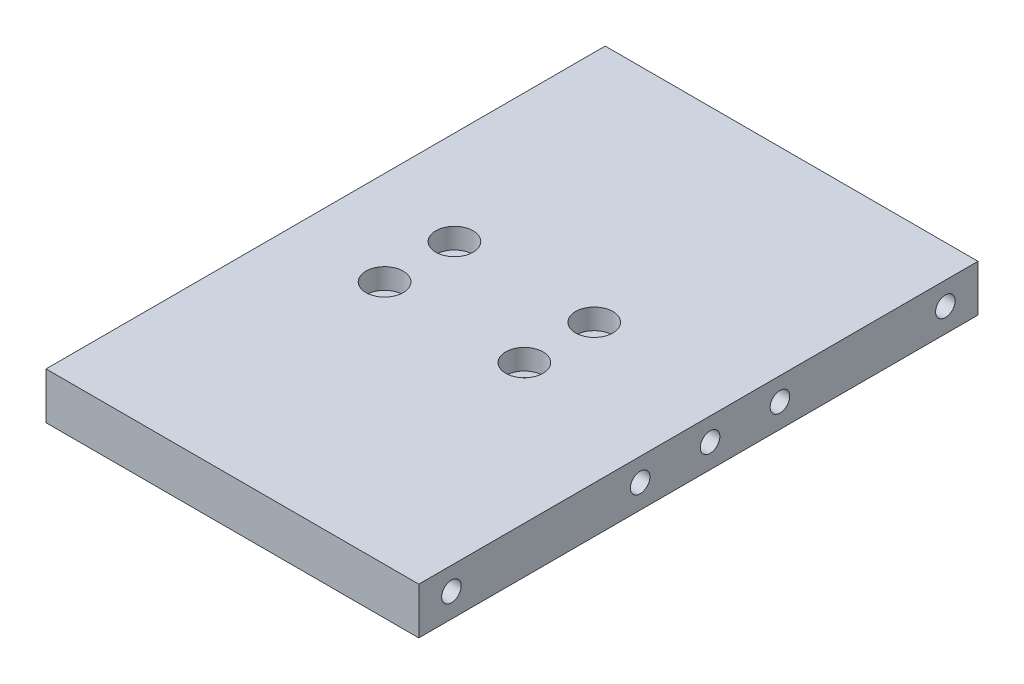
ISO-10303-21;
HEADER;
FILE_DESCRIPTION(('STEP AP214'),'2;1');
FILE_NAME('part.step','',(''),(''),'','','');
FILE_SCHEMA(('AUTOMOTIVE_DESIGN { 1 0 10303 214 1 1 1 1 }'));
ENDSEC;
DATA;
#1=APPLICATION_CONTEXT('core data for automotive mechanical design processes');
#2=APPLICATION_PROTOCOL_DEFINITION('international standard','automotive_design',2000,#1);
#3=PRODUCT_CONTEXT('',#1,'mechanical');
#4=PRODUCT('Part','Part','',(#3));
#5=PRODUCT_RELATED_PRODUCT_CATEGORY('part','',(#4));
#6=PRODUCT_DEFINITION_FORMATION('','',#4);
#7=PRODUCT_DEFINITION_CONTEXT('part definition',#1,'design');
#8=PRODUCT_DEFINITION('design','',#6,#7);
#9=PRODUCT_DEFINITION_SHAPE('','',#8);
#10=(LENGTH_UNIT() NAMED_UNIT(*) SI_UNIT(.MILLI.,.METRE.));
#11=(NAMED_UNIT(*) PLANE_ANGLE_UNIT() SI_UNIT($,.RADIAN.));
#12=(NAMED_UNIT(*) SI_UNIT($,.STERADIAN.) SOLID_ANGLE_UNIT());
#13=UNCERTAINTY_MEASURE_WITH_UNIT(LENGTH_MEASURE(1.E-05),#10,'distance_accuracy_value','');
#14=(GEOMETRIC_REPRESENTATION_CONTEXT(3) GLOBAL_UNCERTAINTY_ASSIGNED_CONTEXT((#13)) GLOBAL_UNIT_ASSIGNED_CONTEXT((#10,
#11,#12)) REPRESENTATION_CONTEXT('',''));
#15=CARTESIAN_POINT('',(0.,0.,0.));
#16=DIRECTION('',(0.,0.,1.));
#17=DIRECTION('',(1.,0.,0.));
#18=AXIS2_PLACEMENT_3D('',#15,#16,#17);
#19=CARTESIAN_POINT('',(-40.,5.,60.));
#20=DIRECTION('',(1.,0.,0.));
#21=DIRECTION('',(0.,0.,-1.));
#22=AXIS2_PLACEMENT_3D('',#19,#20,#21);
#23=PLANE('',#22);
#24=DIRECTION('',(0.,0.,1.));
#25=VECTOR('',#24,1.);
#26=CARTESIAN_POINT('',(-40.,-5.,60.));
#27=LINE('',#26,#25);
#28=CARTESIAN_POINT('',(-40.,-5.,-60.));
#29=VERTEX_POINT('',#28);
#30=CARTESIAN_POINT('',(-40.,-5.,60.));
#31=VERTEX_POINT('',#30);
#32=EDGE_CURVE('E204',#29,#31,#27,.T.);
#33=ORIENTED_EDGE('',*,*,#32,.T.);
#34=DIRECTION('',(0.,-1.,0.));
#35=VECTOR('',#34,1.);
#36=CARTESIAN_POINT('',(-40.,5.,60.));
#37=LINE('',#36,#35);
#38=CARTESIAN_POINT('',(-40.,5.,60.));
#39=VERTEX_POINT('',#38);
#40=EDGE_CURVE('E11',#39,#31,#37,.T.);
#41=ORIENTED_EDGE('',*,*,#40,.F.);
#42=DIRECTION('',(0.,0.,1.));
#43=VECTOR('',#42,1.);
#44=CARTESIAN_POINT('',(-40.,5.,60.));
#45=LINE('',#44,#43);
#46=CARTESIAN_POINT('',(-40.,5.,-60.));
#47=VERTEX_POINT('',#46);
#48=EDGE_CURVE('E205',#47,#39,#45,.T.);
#49=ORIENTED_EDGE('',*,*,#48,.F.);
#50=DIRECTION('',(0.,-1.,0.));
#51=VECTOR('',#50,1.);
#52=CARTESIAN_POINT('',(-40.,5.,-60.));
#53=LINE('',#52,#51);
#54=EDGE_CURVE('E211',#47,#29,#53,.T.);
#55=ORIENTED_EDGE('',*,*,#54,.T.);
#56=EDGE_LOOP('',(#33,#41,#49,#55));
#57=FACE_BOUND('',#56,.T.);
#58=ADVANCED_FACE('F42',(#57),#23,.F.);
#59=CARTESIAN_POINT('',(40.,5.,60.));
#60=DIRECTION('',(0.,0.,-1.));
#61=DIRECTION('',(-1.,0.,0.));
#62=AXIS2_PLACEMENT_3D('',#59,#60,#61);
#63=PLANE('',#62);
#64=DIRECTION('',(1.,0.,0.));
#65=VECTOR('',#64,1.);
#66=CARTESIAN_POINT('',(40.,-5.,60.));
#67=LINE('',#66,#65);
#68=CARTESIAN_POINT('',(40.,-5.,60.));
#69=VERTEX_POINT('',#68);
#70=EDGE_CURVE('E214',#31,#69,#67,.T.);
#71=ORIENTED_EDGE('',*,*,#70,.T.);
#72=DIRECTION('',(0.,-1.,0.));
#73=VECTOR('',#72,1.);
#74=CARTESIAN_POINT('',(40.,5.,60.));
#75=LINE('',#74,#73);
#76=CARTESIAN_POINT('',(40.,5.,60.));
#77=VERTEX_POINT('',#76);
#78=EDGE_CURVE('E50',#77,#69,#75,.T.);
#79=ORIENTED_EDGE('',*,*,#78,.F.);
#80=DIRECTION('',(1.,0.,0.));
#81=VECTOR('',#80,1.);
#82=CARTESIAN_POINT('',(40.,5.,60.));
#83=LINE('',#82,#81);
#84=EDGE_CURVE('E95',#39,#77,#83,.T.);
#85=ORIENTED_EDGE('',*,*,#84,.F.);
#86=ORIENTED_EDGE('',*,*,#40,.T.);
#87=EDGE_LOOP('',(#71,#79,#85,#86));
#88=FACE_BOUND('',#87,.T.);
#89=ADVANCED_FACE('F277',(#88),#63,.F.);
#90=CARTESIAN_POINT('',(40.,5.,60.));
#91=DIRECTION('',(-1.,0.,0.));
#92=DIRECTION('',(0.,0.,1.));
#93=AXIS2_PLACEMENT_3D('',#90,#91,#92);
#94=PLANE('',#93);
#95=CARTESIAN_POINT('',(40.,0.150021457665073,-52.9999999999997));
#96=DIRECTION('',(1.,0.,0.));
#97=DIRECTION('',(0.,0.,-1.));
#98=AXIS2_PLACEMENT_3D('',#95,#96,#97);
#99=CIRCLE('',#98,2.1);
#100=CARTESIAN_POINT('',(40.,0.150021457665073,-55.0999999999997));
#101=VERTEX_POINT('',#100);
#102=EDGE_CURVE('E171',#101,#101,#99,.T.);
#103=ORIENTED_EDGE('',*,*,#102,.F.);
#104=EDGE_LOOP('',(#103));
#105=FACE_BOUND('',#104,.T.);
#106=CARTESIAN_POINT('',(40.,0.150021457665073,-17.5));
#107=DIRECTION('',(1.,0.,0.));
#108=DIRECTION('',(0.,0.,-1.));
#109=AXIS2_PLACEMENT_3D('',#106,#107,#108);
#110=CIRCLE('',#109,2.1);
#111=CARTESIAN_POINT('',(40.,0.150021457665073,-19.6));
#112=VERTEX_POINT('',#111);
#113=EDGE_CURVE('E180',#112,#112,#110,.T.);
#114=ORIENTED_EDGE('',*,*,#113,.F.);
#115=EDGE_LOOP('',(#114));
#116=FACE_BOUND('',#115,.T.);
#117=CARTESIAN_POINT('',(40.,0.150021457665073,-2.50000000000001));
#118=DIRECTION('',(1.,0.,0.));
#119=DIRECTION('',(0.,0.,-1.));
#120=AXIS2_PLACEMENT_3D('',#117,#118,#119);
#121=CIRCLE('',#120,2.1);
#122=CARTESIAN_POINT('',(40.,0.150021457665073,-4.60000000000001));
#123=VERTEX_POINT('',#122);
#124=EDGE_CURVE('E186',#123,#123,#121,.T.);
#125=ORIENTED_EDGE('',*,*,#124,.F.);
#126=EDGE_LOOP('',(#125));
#127=FACE_BOUND('',#126,.T.);
#128=CARTESIAN_POINT('',(40.,0.150021457665073,12.5));
#129=DIRECTION('',(1.,0.,0.));
#130=DIRECTION('',(0.,0.,-1.));
#131=AXIS2_PLACEMENT_3D('',#128,#129,#130);
#132=CIRCLE('',#131,2.1);
#133=CARTESIAN_POINT('',(40.,0.150021457665073,10.4));
#134=VERTEX_POINT('',#133);
#135=EDGE_CURVE('E192',#134,#134,#132,.T.);
#136=ORIENTED_EDGE('',*,*,#135,.F.);
#137=EDGE_LOOP('',(#136));
#138=FACE_BOUND('',#137,.T.);
#139=CARTESIAN_POINT('',(40.,0.150021457665073,53.0000000000003));
#140=DIRECTION('',(1.,0.,0.));
#141=DIRECTION('',(0.,0.,-1.));
#142=AXIS2_PLACEMENT_3D('',#139,#140,#141);
#143=CIRCLE('',#142,2.1);
#144=CARTESIAN_POINT('',(40.,0.150021457665073,50.9000000000003));
#145=VERTEX_POINT('',#144);
#146=EDGE_CURVE('E198',#145,#145,#143,.T.);
#147=ORIENTED_EDGE('',*,*,#146,.F.);
#148=EDGE_LOOP('',(#147));
#149=FACE_BOUND('',#148,.T.);
#150=DIRECTION('',(0.,0.,-1.));
#151=VECTOR('',#150,1.);
#152=CARTESIAN_POINT('',(40.,-5.,60.));
#153=LINE('',#152,#151);
#154=CARTESIAN_POINT('',(40.,-5.,-60.));
#155=VERTEX_POINT('',#154);
#156=EDGE_CURVE('E216',#69,#155,#153,.T.);
#157=ORIENTED_EDGE('',*,*,#156,.T.);
#158=DIRECTION('',(0.,-1.,0.));
#159=VECTOR('',#158,1.);
#160=CARTESIAN_POINT('',(40.,5.,-60.));
#161=LINE('',#160,#159);
#162=CARTESIAN_POINT('',(40.,5.,-60.));
#163=VERTEX_POINT('',#162);
#164=EDGE_CURVE('E220',#163,#155,#161,.T.);
#165=ORIENTED_EDGE('',*,*,#164,.F.);
#166=DIRECTION('',(0.,0.,-1.));
#167=VECTOR('',#166,1.);
#168=CARTESIAN_POINT('',(40.,5.,60.));
#169=LINE('',#168,#167);
#170=EDGE_CURVE('E208',#77,#163,#169,.T.);
#171=ORIENTED_EDGE('',*,*,#170,.F.);
#172=ORIENTED_EDGE('',*,*,#78,.T.);
#173=EDGE_LOOP('',(#157,#165,#171,#172));
#174=FACE_BOUND('',#173,.T.);
#175=ADVANCED_FACE('F282',(#105,#116,#127,#138,#149,#174),#94,.F.);
#176=CARTESIAN_POINT('',(40.,5.,-60.));
#177=DIRECTION('',(0.,0.,1.));
#178=DIRECTION('',(1.,0.,0.));
#179=AXIS2_PLACEMENT_3D('',#176,#177,#178);
#180=PLANE('',#179);
#181=DIRECTION('',(-1.,0.,0.));
#182=VECTOR('',#181,1.);
#183=CARTESIAN_POINT('',(40.,-5.,-60.));
#184=LINE('',#183,#182);
#185=EDGE_CURVE('E88',#155,#29,#184,.T.);
#186=ORIENTED_EDGE('',*,*,#185,.T.);
#187=ORIENTED_EDGE('',*,*,#54,.F.);
#188=DIRECTION('',(-1.,0.,0.));
#189=VECTOR('',#188,1.);
#190=CARTESIAN_POINT('',(40.,5.,-60.));
#191=LINE('',#190,#189);
#192=EDGE_CURVE('E67',#163,#47,#191,.T.);
#193=ORIENTED_EDGE('',*,*,#192,.F.);
#194=ORIENTED_EDGE('',*,*,#164,.T.);
#195=EDGE_LOOP('',(#186,#187,#193,#194));
#196=FACE_BOUND('',#195,.T.);
#197=ADVANCED_FACE('F294',(#196),#180,.F.);
#198=CARTESIAN_POINT('',(0.,5.,0.));
#199=DIRECTION('',(0.,1.,0.));
#200=DIRECTION('',(0.,0.,1.));
#201=AXIS2_PLACEMENT_3D('',#198,#199,#200);
#202=PLANE('',#201);
#203=CARTESIAN_POINT('',(-19.8500013696622,5.,-7.50000000000814));
#204=DIRECTION('',(0.,1.,0.));
#205=DIRECTION('',(0.,0.,1.));
#206=AXIS2_PLACEMENT_3D('',#203,#204,#205);
#207=CIRCLE('',#206,4.);
#208=CARTESIAN_POINT('',(-19.8500013696622,5.,-3.50000000000814));
#209=VERTEX_POINT('',#208);
#210=EDGE_CURVE('E431',#209,#209,#207,.T.);
#211=ORIENTED_EDGE('',*,*,#210,.F.);
#212=EDGE_LOOP('',(#211));
#213=FACE_BOUND('',#212,.T.);
#214=CARTESIAN_POINT('',(10.1499986303378,5.,-7.50000000000816));
#215=DIRECTION('',(0.,1.,0.));
#216=DIRECTION('',(0.,0.,1.));
#217=AXIS2_PLACEMENT_3D('',#214,#215,#216);
#218=CIRCLE('',#217,4.);
#219=CARTESIAN_POINT('',(10.1499986303378,5.,-3.50000000000816));
#220=VERTEX_POINT('',#219);
#221=EDGE_CURVE('E245',#220,#220,#218,.T.);
#222=ORIENTED_EDGE('',*,*,#221,.F.);
#223=EDGE_LOOP('',(#222));
#224=FACE_BOUND('',#223,.T.);
#225=CARTESIAN_POINT('',(10.1499986303378,5.,7.49999999999185));
#226=DIRECTION('',(0.,1.,0.));
#227=DIRECTION('',(0.,0.,1.));
#228=AXIS2_PLACEMENT_3D('',#225,#226,#227);
#229=CIRCLE('',#228,4.);
#230=CARTESIAN_POINT('',(10.1499986303378,5.,11.4999999999918));
#231=VERTEX_POINT('',#230);
#232=EDGE_CURVE('E232',#231,#231,#229,.T.);
#233=ORIENTED_EDGE('',*,*,#232,.F.);
#234=EDGE_LOOP('',(#233));
#235=FACE_BOUND('',#234,.T.);
#236=CARTESIAN_POINT('',(-19.8500013696622,5.,7.49999999999186));
#237=DIRECTION('',(0.,1.,0.));
#238=DIRECTION('',(0.,0.,1.));
#239=AXIS2_PLACEMENT_3D('',#236,#237,#238);
#240=CIRCLE('',#239,4.);
#241=CARTESIAN_POINT('',(-19.8500013696622,5.,11.4999999999919));
#242=VERTEX_POINT('',#241);
#243=EDGE_CURVE('E228',#242,#242,#240,.T.);
#244=ORIENTED_EDGE('',*,*,#243,.F.);
#245=EDGE_LOOP('',(#244));
#246=FACE_BOUND('',#245,.T.);
#247=ORIENTED_EDGE('',*,*,#48,.T.);
#248=ORIENTED_EDGE('',*,*,#84,.T.);
#249=ORIENTED_EDGE('',*,*,#170,.T.);
#250=ORIENTED_EDGE('',*,*,#192,.T.);
#251=EDGE_LOOP('',(#247,#248,#249,#250));
#252=FACE_BOUND('',#251,.T.);
#253=ADVANCED_FACE('F292',(#213,#224,#235,#246,#252),#202,.T.);
#254=CARTESIAN_POINT('',(0.,-5.,0.));
#255=DIRECTION('',(0.,1.,0.));
#256=DIRECTION('',(0.,0.,1.));
#257=AXIS2_PLACEMENT_3D('',#254,#255,#256);
#258=PLANE('',#257);
#259=DIRECTION('',(-1.,0.,0.));
#260=VECTOR('',#259,1.);
#261=CARTESIAN_POINT('',(-24.85,-5.,15.));
#262=LINE('',#261,#260);
#263=CARTESIAN_POINT('',(15.15,-5.,15.));
#264=VERTEX_POINT('',#263);
#265=CARTESIAN_POINT('',(-24.85,-5.,15.));
#266=VERTEX_POINT('',#265);
#267=EDGE_CURVE('E164',#264,#266,#262,.T.);
#268=ORIENTED_EDGE('',*,*,#267,.F.);
#269=DIRECTION('',(0.,0.,1.));
#270=VECTOR('',#269,1.);
#271=CARTESIAN_POINT('',(15.15,-5.,-15.));
#272=LINE('',#271,#270);
#273=CARTESIAN_POINT('',(15.15,-5.,-15.));
#274=VERTEX_POINT('',#273);
#275=EDGE_CURVE('E58',#274,#264,#272,.T.);
#276=ORIENTED_EDGE('',*,*,#275,.F.);
#277=DIRECTION('',(1.,0.,0.));
#278=VECTOR('',#277,1.);
#279=CARTESIAN_POINT('',(-24.85,-5.,-15.));
#280=LINE('',#279,#278);
#281=CARTESIAN_POINT('',(-24.85,-5.,-15.));
#282=VERTEX_POINT('',#281);
#283=EDGE_CURVE('E152',#282,#274,#280,.T.);
#284=ORIENTED_EDGE('',*,*,#283,.F.);
#285=DIRECTION('',(0.,0.,-1.));
#286=VECTOR('',#285,1.);
#287=CARTESIAN_POINT('',(-24.85,-5.,-15.));
#288=LINE('',#287,#286);
#289=EDGE_CURVE('E155',#266,#282,#288,.T.);
#290=ORIENTED_EDGE('',*,*,#289,.F.);
#291=EDGE_LOOP('',(#268,#276,#284,#290));
#292=FACE_BOUND('',#291,.T.);
#293=ORIENTED_EDGE('',*,*,#32,.F.);
#294=ORIENTED_EDGE('',*,*,#185,.F.);
#295=ORIENTED_EDGE('',*,*,#156,.F.);
#296=ORIENTED_EDGE('',*,*,#70,.F.);
#297=EDGE_LOOP('',(#293,#294,#295,#296));
#298=FACE_BOUND('',#297,.T.);
#299=ADVANCED_FACE('F287',(#292,#298),#258,.F.);
#300=CARTESIAN_POINT('',(20.,0.150021457665073,53.0000000000003));
#301=DIRECTION('',(1.,0.,0.));
#302=DIRECTION('',(0.,0.,-1.));
#303=AXIS2_PLACEMENT_3D('',#300,#301,#302);
#304=CONICAL_SURFACE('',#303,2.1,1.02974425867665);
#305=CARTESIAN_POINT('',(18.7381927000421,0.150021457665067,53.0000000000003));
#306=VERTEX_POINT('',#305);
#307=VERTEX_LOOP('',#306);
#308=FACE_BOUND('',#307,.T.);
#309=CARTESIAN_POINT('',(20.,0.150021457665073,53.0000000000003));
#310=DIRECTION('',(1.,0.,0.));
#311=DIRECTION('',(0.,0.,-1.));
#312=AXIS2_PLACEMENT_3D('',#309,#310,#311);
#313=CIRCLE('',#312,2.1);
#314=CARTESIAN_POINT('',(20.,0.150021457665073,50.9000000000003));
#315=VERTEX_POINT('',#314);
#316=EDGE_CURVE('E201',#315,#315,#313,.T.);
#317=ORIENTED_EDGE('',*,*,#316,.T.);
#318=EDGE_LOOP('',(#317));
#319=FACE_BOUND('',#318,.T.);
#320=ADVANCED_FACE('F301',(#308,#319),#304,.F.);
#321=CARTESIAN_POINT('',(40.,0.150021457665073,53.0000000000003));
#322=DIRECTION('',(1.,0.,0.));
#323=DIRECTION('',(0.,0.,-1.));
#324=AXIS2_PLACEMENT_3D('',#321,#322,#323);
#325=CYLINDRICAL_SURFACE('',#324,2.1);
#326=ORIENTED_EDGE('',*,*,#316,.F.);
#327=EDGE_LOOP('',(#326));
#328=FACE_BOUND('',#327,.T.);
#329=ORIENTED_EDGE('',*,*,#146,.T.);
#330=EDGE_LOOP('',(#329));
#331=FACE_BOUND('',#330,.T.);
#332=ADVANCED_FACE('F324',(#328,#331),#325,.F.);
#333=CARTESIAN_POINT('',(20.,0.150021457665073,12.5));
#334=DIRECTION('',(1.,0.,0.));
#335=DIRECTION('',(0.,0.,-1.));
#336=AXIS2_PLACEMENT_3D('',#333,#334,#335);
#337=CONICAL_SURFACE('',#336,2.1,1.02974425867665);
#338=CARTESIAN_POINT('',(18.7381927000421,0.150021457665067,12.5));
#339=VERTEX_POINT('',#338);
#340=VERTEX_LOOP('',#339);
#341=FACE_BOUND('',#340,.T.);
#342=CARTESIAN_POINT('',(20.,0.150021457665073,12.5));
#343=DIRECTION('',(1.,0.,0.));
#344=DIRECTION('',(0.,0.,-1.));
#345=AXIS2_PLACEMENT_3D('',#342,#343,#344);
#346=CIRCLE('',#345,2.1);
#347=CARTESIAN_POINT('',(20.,0.150021457665073,10.4));
#348=VERTEX_POINT('',#347);
#349=EDGE_CURVE('E195',#348,#348,#346,.T.);
#350=ORIENTED_EDGE('',*,*,#349,.T.);
#351=EDGE_LOOP('',(#350));
#352=FACE_BOUND('',#351,.T.);
#353=ADVANCED_FACE('F326',(#341,#352),#337,.F.);
#354=CARTESIAN_POINT('',(40.,0.150021457665073,12.5));
#355=DIRECTION('',(1.,0.,0.));
#356=DIRECTION('',(0.,0.,-1.));
#357=AXIS2_PLACEMENT_3D('',#354,#355,#356);
#358=CYLINDRICAL_SURFACE('',#357,2.1);
#359=ORIENTED_EDGE('',*,*,#349,.F.);
#360=EDGE_LOOP('',(#359));
#361=FACE_BOUND('',#360,.T.);
#362=ORIENTED_EDGE('',*,*,#135,.T.);
#363=EDGE_LOOP('',(#362));
#364=FACE_BOUND('',#363,.T.);
#365=ADVANCED_FACE('F332',(#361,#364),#358,.F.);
#366=CARTESIAN_POINT('',(20.,0.150021457665073,-2.50000000000001));
#367=DIRECTION('',(1.,0.,0.));
#368=DIRECTION('',(0.,0.,-1.));
#369=AXIS2_PLACEMENT_3D('',#366,#367,#368);
#370=CONICAL_SURFACE('',#369,2.1,1.02974425867665);
#371=CARTESIAN_POINT('',(18.7381927000421,0.150021457665067,-2.50000000000001));
#372=VERTEX_POINT('',#371);
#373=VERTEX_LOOP('',#372);
#374=FACE_BOUND('',#373,.T.);
#375=CARTESIAN_POINT('',(20.,0.150021457665073,-2.50000000000001));
#376=DIRECTION('',(1.,0.,0.));
#377=DIRECTION('',(0.,0.,-1.));
#378=AXIS2_PLACEMENT_3D('',#375,#376,#377);
#379=CIRCLE('',#378,2.1);
#380=CARTESIAN_POINT('',(20.,0.150021457665073,-4.60000000000001));
#381=VERTEX_POINT('',#380);
#382=EDGE_CURVE('E189',#381,#381,#379,.T.);
#383=ORIENTED_EDGE('',*,*,#382,.T.);
#384=EDGE_LOOP('',(#383));
#385=FACE_BOUND('',#384,.T.);
#386=ADVANCED_FACE('F340',(#374,#385),#370,.F.);
#387=CARTESIAN_POINT('',(40.,0.150021457665073,-2.50000000000001));
#388=DIRECTION('',(1.,0.,0.));
#389=DIRECTION('',(0.,0.,-1.));
#390=AXIS2_PLACEMENT_3D('',#387,#388,#389);
#391=CYLINDRICAL_SURFACE('',#390,2.1);
#392=ORIENTED_EDGE('',*,*,#382,.F.);
#393=EDGE_LOOP('',(#392));
#394=FACE_BOUND('',#393,.T.);
#395=ORIENTED_EDGE('',*,*,#124,.T.);
#396=EDGE_LOOP('',(#395));
#397=FACE_BOUND('',#396,.T.);
#398=ADVANCED_FACE('F344',(#394,#397),#391,.F.);
#399=CARTESIAN_POINT('',(20.,0.150021457665073,-17.5));
#400=DIRECTION('',(1.,0.,0.));
#401=DIRECTION('',(0.,0.,-1.));
#402=AXIS2_PLACEMENT_3D('',#399,#400,#401);
#403=CONICAL_SURFACE('',#402,2.1,1.02974425867665);
#404=CARTESIAN_POINT('',(18.7381927000421,0.150021457665067,-17.5));
#405=VERTEX_POINT('',#404);
#406=VERTEX_LOOP('',#405);
#407=FACE_BOUND('',#406,.T.);
#408=CARTESIAN_POINT('',(20.,0.150021457665073,-17.5));
#409=DIRECTION('',(1.,0.,0.));
#410=DIRECTION('',(0.,0.,-1.));
#411=AXIS2_PLACEMENT_3D('',#408,#409,#410);
#412=CIRCLE('',#411,2.1);
#413=CARTESIAN_POINT('',(20.,0.150021457665073,-19.6));
#414=VERTEX_POINT('',#413);
#415=EDGE_CURVE('E183',#414,#414,#412,.T.);
#416=ORIENTED_EDGE('',*,*,#415,.T.);
#417=EDGE_LOOP('',(#416));
#418=FACE_BOUND('',#417,.T.);
#419=ADVANCED_FACE('F348',(#407,#418),#403,.F.);
#420=CARTESIAN_POINT('',(40.,0.150021457665073,-17.5));
#421=DIRECTION('',(1.,0.,0.));
#422=DIRECTION('',(0.,0.,-1.));
#423=AXIS2_PLACEMENT_3D('',#420,#421,#422);
#424=CYLINDRICAL_SURFACE('',#423,2.1);
#425=ORIENTED_EDGE('',*,*,#415,.F.);
#426=EDGE_LOOP('',(#425));
#427=FACE_BOUND('',#426,.T.);
#428=ORIENTED_EDGE('',*,*,#113,.T.);
#429=EDGE_LOOP('',(#428));
#430=FACE_BOUND('',#429,.T.);
#431=ADVANCED_FACE('F352',(#427,#430),#424,.F.);
#432=CARTESIAN_POINT('',(20.,0.150021457665073,-52.9999999999997));
#433=DIRECTION('',(1.,0.,0.));
#434=DIRECTION('',(0.,0.,-1.));
#435=AXIS2_PLACEMENT_3D('',#432,#433,#434);
#436=CONICAL_SURFACE('',#435,2.1,1.02974425867665);
#437=CARTESIAN_POINT('',(18.7381927000421,0.150021457665067,-52.9999999999997));
#438=VERTEX_POINT('',#437);
#439=VERTEX_LOOP('',#438);
#440=FACE_BOUND('',#439,.T.);
#441=CARTESIAN_POINT('',(20.,0.150021457665073,-52.9999999999997));
#442=DIRECTION('',(1.,0.,0.));
#443=DIRECTION('',(0.,0.,-1.));
#444=AXIS2_PLACEMENT_3D('',#441,#442,#443);
#445=CIRCLE('',#444,2.1);
#446=CARTESIAN_POINT('',(20.,0.150021457665073,-55.0999999999997));
#447=VERTEX_POINT('',#446);
#448=EDGE_CURVE('E177',#447,#447,#445,.T.);
#449=ORIENTED_EDGE('',*,*,#448,.T.);
#450=EDGE_LOOP('',(#449));
#451=FACE_BOUND('',#450,.T.);
#452=ADVANCED_FACE('F356',(#440,#451),#436,.F.);
#453=CARTESIAN_POINT('',(40.,0.150021457665073,-52.9999999999997));
#454=DIRECTION('',(1.,0.,0.));
#455=DIRECTION('',(0.,0.,-1.));
#456=AXIS2_PLACEMENT_3D('',#453,#454,#455);
#457=CYLINDRICAL_SURFACE('',#456,2.1);
#458=ORIENTED_EDGE('',*,*,#448,.F.);
#459=EDGE_LOOP('',(#458));
#460=FACE_BOUND('',#459,.T.);
#461=ORIENTED_EDGE('',*,*,#102,.T.);
#462=EDGE_LOOP('',(#461));
#463=FACE_BOUND('',#462,.T.);
#464=ADVANCED_FACE('F360',(#460,#463),#457,.F.);
#465=CARTESIAN_POINT('',(15.15,-2.,-15.));
#466=DIRECTION('',(1.,0.,0.));
#467=DIRECTION('',(0.,0.,-1.));
#468=AXIS2_PLACEMENT_3D('',#465,#466,#467);
#469=PLANE('',#468);
#470=ORIENTED_EDGE('',*,*,#275,.T.);
#471=DIRECTION('',(0.,-1.,0.));
#472=VECTOR('',#471,1.);
#473=CARTESIAN_POINT('',(15.15,-2.,15.));
#474=LINE('',#473,#472);
#475=CARTESIAN_POINT('',(15.15,-2.,15.));
#476=VERTEX_POINT('',#475);
#477=EDGE_CURVE('E130',#476,#264,#474,.T.);
#478=ORIENTED_EDGE('',*,*,#477,.F.);
#479=DIRECTION('',(0.,0.,1.));
#480=VECTOR('',#479,1.);
#481=CARTESIAN_POINT('',(15.15,-2.,-15.));
#482=LINE('',#481,#480);
#483=CARTESIAN_POINT('',(15.15,-2.,-15.));
#484=VERTEX_POINT('',#483);
#485=EDGE_CURVE('E134',#484,#476,#482,.T.);
#486=ORIENTED_EDGE('',*,*,#485,.F.);
#487=DIRECTION('',(0.,-1.,0.));
#488=VECTOR('',#487,1.);
#489=CARTESIAN_POINT('',(15.15,-2.,-15.));
#490=LINE('',#489,#488);
#491=EDGE_CURVE('E169',#484,#274,#490,.T.);
#492=ORIENTED_EDGE('',*,*,#491,.T.);
#493=EDGE_LOOP('',(#470,#478,#486,#492));
#494=FACE_BOUND('',#493,.T.);
#495=ADVANCED_FACE('F132',(#494),#469,.F.);
#496=CARTESIAN_POINT('',(-24.85,-2.,-15.));
#497=DIRECTION('',(0.,0.,-1.));
#498=DIRECTION('',(-1.,0.,0.));
#499=AXIS2_PLACEMENT_3D('',#496,#497,#498);
#500=PLANE('',#499);
#501=ORIENTED_EDGE('',*,*,#283,.T.);
#502=ORIENTED_EDGE('',*,*,#491,.F.);
#503=DIRECTION('',(1.,0.,0.));
#504=VECTOR('',#503,1.);
#505=CARTESIAN_POINT('',(-24.85,-2.,-15.));
#506=LINE('',#505,#504);
#507=CARTESIAN_POINT('',(-24.85,-2.,-15.));
#508=VERTEX_POINT('',#507);
#509=EDGE_CURVE('E140',#508,#484,#506,.T.);
#510=ORIENTED_EDGE('',*,*,#509,.F.);
#511=DIRECTION('',(0.,-1.,0.));
#512=VECTOR('',#511,1.);
#513=CARTESIAN_POINT('',(-24.85,-2.,-15.));
#514=LINE('',#513,#512);
#515=EDGE_CURVE('E172',#508,#282,#514,.T.);
#516=ORIENTED_EDGE('',*,*,#515,.T.);
#517=EDGE_LOOP('',(#501,#502,#510,#516));
#518=FACE_BOUND('',#517,.T.);
#519=ADVANCED_FACE('F367',(#518),#500,.F.);
#520=CARTESIAN_POINT('',(-24.85,-2.,-15.));
#521=DIRECTION('',(-1.,0.,0.));
#522=DIRECTION('',(0.,0.,1.));
#523=AXIS2_PLACEMENT_3D('',#520,#521,#522);
#524=PLANE('',#523);
#525=ORIENTED_EDGE('',*,*,#289,.T.);
#526=ORIENTED_EDGE('',*,*,#515,.F.);
#527=DIRECTION('',(0.,0.,-1.));
#528=VECTOR('',#527,1.);
#529=CARTESIAN_POINT('',(-24.85,-2.,-15.));
#530=LINE('',#529,#528);
#531=CARTESIAN_POINT('',(-24.85,-2.,15.));
#532=VERTEX_POINT('',#531);
#533=EDGE_CURVE('E148',#532,#508,#530,.T.);
#534=ORIENTED_EDGE('',*,*,#533,.F.);
#535=DIRECTION('',(0.,-1.,0.));
#536=VECTOR('',#535,1.);
#537=CARTESIAN_POINT('',(-24.85,-2.,15.));
#538=LINE('',#537,#536);
#539=EDGE_CURVE('E139',#532,#266,#538,.T.);
#540=ORIENTED_EDGE('',*,*,#539,.T.);
#541=EDGE_LOOP('',(#525,#526,#534,#540));
#542=FACE_BOUND('',#541,.T.);
#543=ADVANCED_FACE('F370',(#542),#524,.F.);
#544=CARTESIAN_POINT('',(-24.85,-2.,15.));
#545=DIRECTION('',(0.,0.,1.));
#546=DIRECTION('',(1.,0.,0.));
#547=AXIS2_PLACEMENT_3D('',#544,#545,#546);
#548=PLANE('',#547);
#549=ORIENTED_EDGE('',*,*,#267,.T.);
#550=ORIENTED_EDGE('',*,*,#539,.F.);
#551=DIRECTION('',(-1.,0.,0.));
#552=VECTOR('',#551,1.);
#553=CARTESIAN_POINT('',(-24.85,-2.,15.));
#554=LINE('',#553,#552);
#555=EDGE_CURVE('E143',#476,#532,#554,.T.);
#556=ORIENTED_EDGE('',*,*,#555,.F.);
#557=ORIENTED_EDGE('',*,*,#477,.T.);
#558=EDGE_LOOP('',(#549,#550,#556,#557));
#559=FACE_BOUND('',#558,.T.);
#560=ADVANCED_FACE('F144',(#559),#548,.F.);
#561=CARTESIAN_POINT('',(0.,-2.,0.));
#562=DIRECTION('',(0.,1.,0.));
#563=DIRECTION('',(0.,0.,1.));
#564=AXIS2_PLACEMENT_3D('',#561,#562,#563);
#565=PLANE('',#564);
#566=CARTESIAN_POINT('',(-19.8500013696622,-2.,-7.50000000000814));
#567=DIRECTION('',(0.,1.,0.));
#568=DIRECTION('',(0.,0.,1.));
#569=AXIS2_PLACEMENT_3D('',#566,#567,#568);
#570=CIRCLE('',#569,2.25);
#571=CARTESIAN_POINT('',(-19.8500013696622,-2.,-5.25000000000814));
#572=VERTEX_POINT('',#571);
#573=EDGE_CURVE('E45',#572,#572,#570,.T.);
#574=ORIENTED_EDGE('',*,*,#573,.T.);
#575=EDGE_LOOP('',(#574));
#576=FACE_BOUND('',#575,.T.);
#577=CARTESIAN_POINT('',(10.1499986303378,-2.,-7.50000000000816));
#578=DIRECTION('',(0.,1.,0.));
#579=DIRECTION('',(0.,0.,1.));
#580=AXIS2_PLACEMENT_3D('',#577,#578,#579);
#581=CIRCLE('',#580,2.25);
#582=CARTESIAN_POINT('',(10.1499986303378,-2.,-5.25000000000816));
#583=VERTEX_POINT('',#582);
#584=EDGE_CURVE('E230',#583,#583,#581,.T.);
#585=ORIENTED_EDGE('',*,*,#584,.T.);
#586=EDGE_LOOP('',(#585));
#587=FACE_BOUND('',#586,.T.);
#588=CARTESIAN_POINT('',(10.1499986303378,-2.,7.49999999999185));
#589=DIRECTION('',(0.,1.,0.));
#590=DIRECTION('',(0.,0.,1.));
#591=AXIS2_PLACEMENT_3D('',#588,#589,#590);
#592=CIRCLE('',#591,2.25);
#593=CARTESIAN_POINT('',(10.1499986303378,-2.,9.74999999999184));
#594=VERTEX_POINT('',#593);
#595=EDGE_CURVE('E226',#594,#594,#592,.T.);
#596=ORIENTED_EDGE('',*,*,#595,.T.);
#597=EDGE_LOOP('',(#596));
#598=FACE_BOUND('',#597,.T.);
#599=CARTESIAN_POINT('',(-19.8500013696622,-2.,7.49999999999186));
#600=DIRECTION('',(0.,1.,0.));
#601=DIRECTION('',(0.,0.,1.));
#602=AXIS2_PLACEMENT_3D('',#599,#600,#601);
#603=CIRCLE('',#602,2.25);
#604=CARTESIAN_POINT('',(-19.8500013696622,-2.,9.74999999999186));
#605=VERTEX_POINT('',#604);
#606=EDGE_CURVE('E165',#605,#605,#603,.T.);
#607=ORIENTED_EDGE('',*,*,#606,.T.);
#608=EDGE_LOOP('',(#607));
#609=FACE_BOUND('',#608,.T.);
#610=ORIENTED_EDGE('',*,*,#485,.T.);
#611=ORIENTED_EDGE('',*,*,#555,.T.);
#612=ORIENTED_EDGE('',*,*,#533,.T.);
#613=ORIENTED_EDGE('',*,*,#509,.T.);
#614=EDGE_LOOP('',(#610,#611,#612,#613));
#615=FACE_BOUND('',#614,.T.);
#616=ADVANCED_FACE('F150',(#576,#587,#598,#609,#615),#565,.F.);
#617=CARTESIAN_POINT('',(-19.8500013696622,5.,7.49999999999186));
#618=DIRECTION('',(0.,1.,0.));
#619=DIRECTION('',(0.,0.,1.));
#620=AXIS2_PLACEMENT_3D('',#617,#618,#619);
#621=CYLINDRICAL_SURFACE('',#620,2.25);
#622=CARTESIAN_POINT('',(-19.8500013696622,0.600000000000001,7.49999999999186));
#623=DIRECTION('',(0.,1.,0.));
#624=DIRECTION('',(0.,0.,1.));
#625=AXIS2_PLACEMENT_3D('',#622,#623,#624);
#626=CIRCLE('',#625,2.25);
#627=CARTESIAN_POINT('',(-19.8500013696622,0.600000000000001,9.74999999999186));
#628=VERTEX_POINT('',#627);
#629=EDGE_CURVE('E158',#628,#628,#626,.T.);
#630=ORIENTED_EDGE('',*,*,#629,.T.);
#631=EDGE_LOOP('',(#630));
#632=FACE_BOUND('',#631,.T.);
#633=ORIENTED_EDGE('',*,*,#606,.F.);
#634=EDGE_LOOP('',(#633));
#635=FACE_BOUND('',#634,.T.);
#636=ADVANCED_FACE('F261',(#632,#635),#621,.F.);
#637=CARTESIAN_POINT('',(-17.6000013696622,0.600000000000001,7.49999999999186));
#638=DIRECTION('',(0.,-1.,0.));
#639=DIRECTION('',(0.,0.,-1.));
#640=AXIS2_PLACEMENT_3D('',#637,#638,#639);
#641=PLANE('',#640);
#642=ORIENTED_EDGE('',*,*,#629,.F.);
#643=EDGE_LOOP('',(#642));
#644=FACE_BOUND('',#643,.T.);
#645=CARTESIAN_POINT('',(-19.8500013696622,0.600000000000001,7.49999999999186));
#646=DIRECTION('',(0.,1.,0.));
#647=DIRECTION('',(0.,0.,1.));
#648=AXIS2_PLACEMENT_3D('',#645,#646,#647);
#649=CIRCLE('',#648,4.);
#650=CARTESIAN_POINT('',(-19.8500013696622,0.600000000000001,11.4999999999919));
#651=VERTEX_POINT('',#650);
#652=EDGE_CURVE('E254',#651,#651,#649,.T.);
#653=ORIENTED_EDGE('',*,*,#652,.T.);
#654=EDGE_LOOP('',(#653));
#655=FACE_BOUND('',#654,.T.);
#656=ADVANCED_FACE('F264',(#644,#655),#641,.F.);
#657=CARTESIAN_POINT('',(-19.8500013696622,5.,7.49999999999186));
#658=DIRECTION('',(0.,1.,0.));
#659=DIRECTION('',(0.,0.,1.));
#660=AXIS2_PLACEMENT_3D('',#657,#658,#659);
#661=CYLINDRICAL_SURFACE('',#660,4.);
#662=ORIENTED_EDGE('',*,*,#652,.F.);
#663=EDGE_LOOP('',(#662));
#664=FACE_BOUND('',#663,.T.);
#665=ORIENTED_EDGE('',*,*,#243,.T.);
#666=EDGE_LOOP('',(#665));
#667=FACE_BOUND('',#666,.T.);
#668=ADVANCED_FACE('F266',(#664,#667),#661,.F.);
#669=CARTESIAN_POINT('',(10.1499986303378,5.,7.49999999999185));
#670=DIRECTION('',(0.,1.,0.));
#671=DIRECTION('',(0.,0.,1.));
#672=AXIS2_PLACEMENT_3D('',#669,#670,#671);
#673=CYLINDRICAL_SURFACE('',#672,2.25);
#674=CARTESIAN_POINT('',(10.1499986303378,0.600000000000001,7.49999999999185));
#675=DIRECTION('',(0.,1.,0.));
#676=DIRECTION('',(0.,0.,1.));
#677=AXIS2_PLACEMENT_3D('',#674,#675,#676);
#678=CIRCLE('',#677,2.25);
#679=CARTESIAN_POINT('',(10.1499986303378,0.600000000000001,9.74999999999185));
#680=VERTEX_POINT('',#679);
#681=EDGE_CURVE('E229',#680,#680,#678,.T.);
#682=ORIENTED_EDGE('',*,*,#681,.T.);
#683=EDGE_LOOP('',(#682));
#684=FACE_BOUND('',#683,.T.);
#685=ORIENTED_EDGE('',*,*,#595,.F.);
#686=EDGE_LOOP('',(#685));
#687=FACE_BOUND('',#686,.T.);
#688=ADVANCED_FACE('F272',(#684,#687),#673,.F.);
#689=CARTESIAN_POINT('',(12.3999986303378,0.600000000000001,7.49999999999185));
#690=DIRECTION('',(0.,-1.,0.));
#691=DIRECTION('',(0.,0.,-1.));
#692=AXIS2_PLACEMENT_3D('',#689,#690,#691);
#693=PLANE('',#692);
#694=ORIENTED_EDGE('',*,*,#681,.F.);
#695=EDGE_LOOP('',(#694));
#696=FACE_BOUND('',#695,.T.);
#697=CARTESIAN_POINT('',(10.1499986303378,0.600000000000001,7.49999999999185));
#698=DIRECTION('',(0.,1.,0.));
#699=DIRECTION('',(0.,0.,1.));
#700=AXIS2_PLACEMENT_3D('',#697,#698,#699);
#701=CIRCLE('',#700,4.);
#702=CARTESIAN_POINT('',(10.1499986303378,0.600000000000001,11.4999999999918));
#703=VERTEX_POINT('',#702);
#704=EDGE_CURVE('E237',#703,#703,#701,.T.);
#705=ORIENTED_EDGE('',*,*,#704,.T.);
#706=EDGE_LOOP('',(#705));
#707=FACE_BOUND('',#706,.T.);
#708=ADVANCED_FACE('F389',(#696,#707),#693,.F.);
#709=CARTESIAN_POINT('',(10.1499986303378,5.,7.49999999999185));
#710=DIRECTION('',(0.,1.,0.));
#711=DIRECTION('',(0.,0.,1.));
#712=AXIS2_PLACEMENT_3D('',#709,#710,#711);
#713=CYLINDRICAL_SURFACE('',#712,4.);
#714=ORIENTED_EDGE('',*,*,#704,.F.);
#715=EDGE_LOOP('',(#714));
#716=FACE_BOUND('',#715,.T.);
#717=ORIENTED_EDGE('',*,*,#232,.T.);
#718=EDGE_LOOP('',(#717));
#719=FACE_BOUND('',#718,.T.);
#720=ADVANCED_FACE('F395',(#716,#719),#713,.F.);
#721=CARTESIAN_POINT('',(10.1499986303378,5.,-7.50000000000816));
#722=DIRECTION('',(0.,1.,0.));
#723=DIRECTION('',(0.,0.,1.));
#724=AXIS2_PLACEMENT_3D('',#721,#722,#723);
#725=CYLINDRICAL_SURFACE('',#724,2.25);
#726=CARTESIAN_POINT('',(10.1499986303378,0.600000000000001,-7.50000000000816));
#727=DIRECTION('',(0.,1.,0.));
#728=DIRECTION('',(0.,0.,1.));
#729=AXIS2_PLACEMENT_3D('',#726,#727,#728);
#730=CIRCLE('',#729,2.25);
#731=CARTESIAN_POINT('',(10.1499986303378,0.600000000000001,-5.25000000000816));
#732=VERTEX_POINT('',#731);
#733=EDGE_CURVE('E233',#732,#732,#730,.T.);
#734=ORIENTED_EDGE('',*,*,#733,.T.);
#735=EDGE_LOOP('',(#734));
#736=FACE_BOUND('',#735,.T.);
#737=ORIENTED_EDGE('',*,*,#584,.F.);
#738=EDGE_LOOP('',(#737));
#739=FACE_BOUND('',#738,.T.);
#740=ADVANCED_FACE('F401',(#736,#739),#725,.F.);
#741=CARTESIAN_POINT('',(12.3999986303378,0.600000000000001,-7.50000000000816));
#742=DIRECTION('',(0.,-1.,0.));
#743=DIRECTION('',(0.,0.,-1.));
#744=AXIS2_PLACEMENT_3D('',#741,#742,#743);
#745=PLANE('',#744);
#746=ORIENTED_EDGE('',*,*,#733,.F.);
#747=EDGE_LOOP('',(#746));
#748=FACE_BOUND('',#747,.T.);
#749=CARTESIAN_POINT('',(10.1499986303378,0.600000000000001,-7.50000000000816));
#750=DIRECTION('',(0.,1.,0.));
#751=DIRECTION('',(0.,0.,1.));
#752=AXIS2_PLACEMENT_3D('',#749,#750,#751);
#753=CIRCLE('',#752,4.);
#754=CARTESIAN_POINT('',(10.1499986303378,0.600000000000001,-3.50000000000816));
#755=VERTEX_POINT('',#754);
#756=EDGE_CURVE('E240',#755,#755,#753,.T.);
#757=ORIENTED_EDGE('',*,*,#756,.T.);
#758=EDGE_LOOP('',(#757));
#759=FACE_BOUND('',#758,.T.);
#760=ADVANCED_FACE('F405',(#748,#759),#745,.F.);
#761=CARTESIAN_POINT('',(10.1499986303378,5.,-7.50000000000816));
#762=DIRECTION('',(0.,1.,0.));
#763=DIRECTION('',(0.,0.,1.));
#764=AXIS2_PLACEMENT_3D('',#761,#762,#763);
#765=CYLINDRICAL_SURFACE('',#764,4.);
#766=ORIENTED_EDGE('',*,*,#756,.F.);
#767=EDGE_LOOP('',(#766));
#768=FACE_BOUND('',#767,.T.);
#769=ORIENTED_EDGE('',*,*,#221,.T.);
#770=EDGE_LOOP('',(#769));
#771=FACE_BOUND('',#770,.T.);
#772=ADVANCED_FACE('F408',(#768,#771),#765,.F.);
#773=CARTESIAN_POINT('',(-19.8500013696622,5.,-7.50000000000814));
#774=DIRECTION('',(0.,1.,0.));
#775=DIRECTION('',(0.,0.,1.));
#776=AXIS2_PLACEMENT_3D('',#773,#774,#775);
#777=CYLINDRICAL_SURFACE('',#776,2.25);
#778=CARTESIAN_POINT('',(-19.8500013696622,0.600000000000001,-7.50000000000814));
#779=DIRECTION('',(0.,1.,0.));
#780=DIRECTION('',(0.,0.,1.));
#781=AXIS2_PLACEMENT_3D('',#778,#779,#780);
#782=CIRCLE('',#781,2.25);
#783=CARTESIAN_POINT('',(-19.8500013696622,0.600000000000001,-5.25000000000814));
#784=VERTEX_POINT('',#783);
#785=EDGE_CURVE('E433',#784,#784,#782,.T.);
#786=ORIENTED_EDGE('',*,*,#785,.T.);
#787=EDGE_LOOP('',(#786));
#788=FACE_BOUND('',#787,.T.);
#789=ORIENTED_EDGE('',*,*,#573,.F.);
#790=EDGE_LOOP('',(#789));
#791=FACE_BOUND('',#790,.T.);
#792=ADVANCED_FACE('F412',(#788,#791),#777,.F.);
#793=CARTESIAN_POINT('',(-17.6000013696622,0.600000000000001,-7.50000000000814));
#794=DIRECTION('',(0.,-1.,0.));
#795=DIRECTION('',(0.,0.,-1.));
#796=AXIS2_PLACEMENT_3D('',#793,#794,#795);
#797=PLANE('',#796);
#798=ORIENTED_EDGE('',*,*,#785,.F.);
#799=EDGE_LOOP('',(#798));
#800=FACE_BOUND('',#799,.T.);
#801=CARTESIAN_POINT('',(-19.8500013696622,0.600000000000001,-7.50000000000814));
#802=DIRECTION('',(0.,1.,0.));
#803=DIRECTION('',(0.,0.,1.));
#804=AXIS2_PLACEMENT_3D('',#801,#802,#803);
#805=CIRCLE('',#804,4.);
#806=CARTESIAN_POINT('',(-19.8500013696622,0.600000000000001,-3.50000000000814));
#807=VERTEX_POINT('',#806);
#808=EDGE_CURVE('E429',#807,#807,#805,.T.);
#809=ORIENTED_EDGE('',*,*,#808,.T.);
#810=EDGE_LOOP('',(#809));
#811=FACE_BOUND('',#810,.T.);
#812=ADVANCED_FACE('F416',(#800,#811),#797,.F.);
#813=CARTESIAN_POINT('',(-19.8500013696622,5.,-7.50000000000814));
#814=DIRECTION('',(0.,1.,0.));
#815=DIRECTION('',(0.,0.,1.));
#816=AXIS2_PLACEMENT_3D('',#813,#814,#815);
#817=CYLINDRICAL_SURFACE('',#816,4.);
#818=ORIENTED_EDGE('',*,*,#808,.F.);
#819=EDGE_LOOP('',(#818));
#820=FACE_BOUND('',#819,.T.);
#821=ORIENTED_EDGE('',*,*,#210,.T.);
#822=EDGE_LOOP('',(#821));
#823=FACE_BOUND('',#822,.T.);
#824=ADVANCED_FACE('F420',(#820,#823),#817,.F.);
#825=CLOSED_SHELL('',(#58,#89,#175,#197,#253,#299,#320,#332,#353,#365,#386,#398,#419,#431,#452,
#464,#495,#519,#543,#560,#616,#636,#656,#668,#688,#708,#720,#740,#760,#772,#792,#812,#824));
#826=MANIFOLD_SOLID_BREP('B2',#825);
#827=ADVANCED_BREP_SHAPE_REPRESENTATION('',(#18,#826),#14);
#828=SHAPE_DEFINITION_REPRESENTATION(#9,#827);
ENDSEC;
END-ISO-10303-21;
